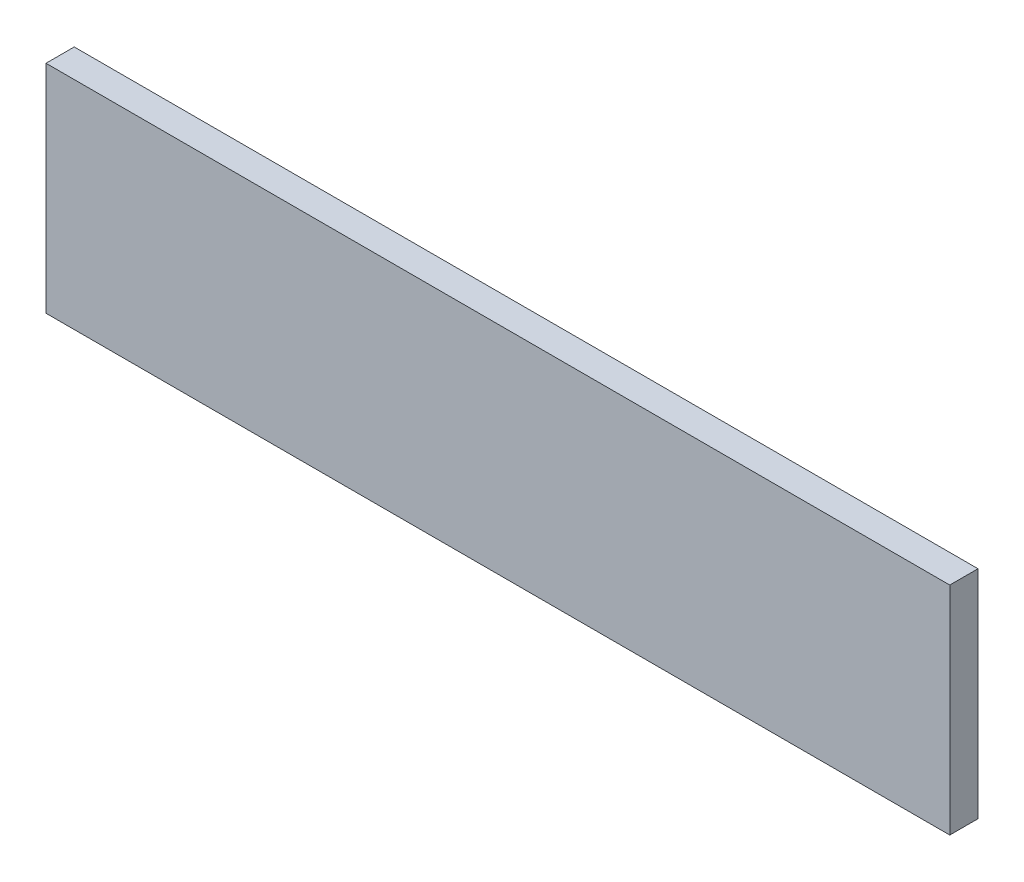
ISO-10303-21;
HEADER;
FILE_DESCRIPTION(('STEP AP214'),'2;1');
FILE_NAME('part.step','',(''),(''),'','','');
FILE_SCHEMA(('AUTOMOTIVE_DESIGN { 1 0 10303 214 1 1 1 1 }'));
ENDSEC;
DATA;
#1=APPLICATION_CONTEXT('core data for automotive mechanical design processes');
#2=APPLICATION_PROTOCOL_DEFINITION('international standard','automotive_design',2000,#1);
#3=PRODUCT_CONTEXT('',#1,'mechanical');
#4=PRODUCT('Part','Part','',(#3));
#5=PRODUCT_RELATED_PRODUCT_CATEGORY('part','',(#4));
#6=PRODUCT_DEFINITION_FORMATION('','',#4);
#7=PRODUCT_DEFINITION_CONTEXT('part definition',#1,'design');
#8=PRODUCT_DEFINITION('design','',#6,#7);
#9=PRODUCT_DEFINITION_SHAPE('','',#8);
#10=(LENGTH_UNIT() NAMED_UNIT(*) SI_UNIT(.MILLI.,.METRE.));
#11=(NAMED_UNIT(*) PLANE_ANGLE_UNIT() SI_UNIT($,.RADIAN.));
#12=(NAMED_UNIT(*) SI_UNIT($,.STERADIAN.) SOLID_ANGLE_UNIT());
#13=UNCERTAINTY_MEASURE_WITH_UNIT(LENGTH_MEASURE(1.E-05),#10,'distance_accuracy_value','');
#14=(GEOMETRIC_REPRESENTATION_CONTEXT(3) GLOBAL_UNCERTAINTY_ASSIGNED_CONTEXT((#13)) GLOBAL_UNIT_ASSIGNED_CONTEXT((#10,
#11,#12)) REPRESENTATION_CONTEXT('',''));
#15=CARTESIAN_POINT('',(0.,0.,0.));
#16=DIRECTION('',(0.,0.,1.));
#17=DIRECTION('',(1.,0.,0.));
#18=AXIS2_PLACEMENT_3D('',#15,#16,#17);
#19=CARTESIAN_POINT('',(304.8,73.025,19.05));
#20=DIRECTION('',(-1.,0.,0.));
#21=DIRECTION('',(0.,-1.,0.));
#22=AXIS2_PLACEMENT_3D('',#19,#20,#21);
#23=PLANE('',#22);
#24=DIRECTION('',(0.,1.,0.));
#25=VECTOR('',#24,1.);
#26=CARTESIAN_POINT('',(304.8,73.025,0.));
#27=LINE('',#26,#25);
#28=CARTESIAN_POINT('',(304.8,-73.025,0.));
#29=VERTEX_POINT('',#28);
#30=CARTESIAN_POINT('',(304.8,73.025,0.));
#31=VERTEX_POINT('',#30);
#32=EDGE_CURVE('E100',#29,#31,#27,.T.);
#33=ORIENTED_EDGE('',*,*,#32,.T.);
#34=DIRECTION('',(0.,0.,-1.));
#35=VECTOR('',#34,1.);
#36=CARTESIAN_POINT('',(304.8,73.025,19.05));
#37=LINE('',#36,#35);
#38=CARTESIAN_POINT('',(304.8,73.025,19.05));
#39=VERTEX_POINT('',#38);
#40=EDGE_CURVE('E11',#39,#31,#37,.T.);
#41=ORIENTED_EDGE('',*,*,#40,.F.);
#42=DIRECTION('',(0.,1.,0.));
#43=VECTOR('',#42,1.);
#44=CARTESIAN_POINT('',(304.8,73.025,19.05));
#45=LINE('',#44,#43);
#46=CARTESIAN_POINT('',(304.8,-73.025,19.05));
#47=VERTEX_POINT('',#46);
#48=EDGE_CURVE('E88',#47,#39,#45,.T.);
#49=ORIENTED_EDGE('',*,*,#48,.F.);
#50=DIRECTION('',(0.,0.,-1.));
#51=VECTOR('',#50,1.);
#52=CARTESIAN_POINT('',(304.8,-73.025,19.05));
#53=LINE('',#52,#51);
#54=EDGE_CURVE('E96',#47,#29,#53,.T.);
#55=ORIENTED_EDGE('',*,*,#54,.T.);
#56=EDGE_LOOP('',(#33,#41,#49,#55));
#57=FACE_BOUND('',#56,.T.);
#58=ADVANCED_FACE('F37',(#57),#23,.F.);
#59=CARTESIAN_POINT('',(-304.8,73.025,19.05));
#60=DIRECTION('',(0.,-1.,0.));
#61=DIRECTION('',(0.,0.,-1.));
#62=AXIS2_PLACEMENT_3D('',#59,#60,#61);
#63=PLANE('',#62);
#64=DIRECTION('',(-1.,0.,0.));
#65=VECTOR('',#64,1.);
#66=CARTESIAN_POINT('',(-304.8,73.025,0.));
#67=LINE('',#66,#65);
#68=CARTESIAN_POINT('',(-304.8,73.025,0.));
#69=VERTEX_POINT('',#68);
#70=EDGE_CURVE('E92',#31,#69,#67,.T.);
#71=ORIENTED_EDGE('',*,*,#70,.T.);
#72=DIRECTION('',(0.,0.,-1.));
#73=VECTOR('',#72,1.);
#74=CARTESIAN_POINT('',(-304.8,73.025,19.05));
#75=LINE('',#74,#73);
#76=CARTESIAN_POINT('',(-304.8,73.025,19.05));
#77=VERTEX_POINT('',#76);
#78=EDGE_CURVE('E45',#77,#69,#75,.T.);
#79=ORIENTED_EDGE('',*,*,#78,.F.);
#80=DIRECTION('',(-1.,0.,0.));
#81=VECTOR('',#80,1.);
#82=CARTESIAN_POINT('',(-304.8,73.025,19.05));
#83=LINE('',#82,#81);
#84=EDGE_CURVE('E83',#39,#77,#83,.T.);
#85=ORIENTED_EDGE('',*,*,#84,.F.);
#86=ORIENTED_EDGE('',*,*,#40,.T.);
#87=EDGE_LOOP('',(#71,#79,#85,#86));
#88=FACE_BOUND('',#87,.T.);
#89=ADVANCED_FACE('F91',(#88),#63,.F.);
#90=CARTESIAN_POINT('',(-304.8,73.025,19.05));
#91=DIRECTION('',(1.,0.,0.));
#92=DIRECTION('',(0.,1.,0.));
#93=AXIS2_PLACEMENT_3D('',#90,#91,#92);
#94=PLANE('',#93);
#95=DIRECTION('',(0.,-1.,0.));
#96=VECTOR('',#95,1.);
#97=CARTESIAN_POINT('',(-304.8,73.025,0.));
#98=LINE('',#97,#96);
#99=CARTESIAN_POINT('',(-304.8,-73.025,0.));
#100=VERTEX_POINT('',#99);
#101=EDGE_CURVE('E70',#69,#100,#98,.T.);
#102=ORIENTED_EDGE('',*,*,#101,.T.);
#103=DIRECTION('',(0.,0.,-1.));
#104=VECTOR('',#103,1.);
#105=CARTESIAN_POINT('',(-304.8,-73.025,19.05));
#106=LINE('',#105,#104);
#107=CARTESIAN_POINT('',(-304.8,-73.025,19.05));
#108=VERTEX_POINT('',#107);
#109=EDGE_CURVE('E93',#108,#100,#106,.T.);
#110=ORIENTED_EDGE('',*,*,#109,.F.);
#111=DIRECTION('',(0.,-1.,0.));
#112=VECTOR('',#111,1.);
#113=CARTESIAN_POINT('',(-304.8,73.025,19.05));
#114=LINE('',#113,#112);
#115=EDGE_CURVE('E86',#77,#108,#114,.T.);
#116=ORIENTED_EDGE('',*,*,#115,.F.);
#117=ORIENTED_EDGE('',*,*,#78,.T.);
#118=EDGE_LOOP('',(#102,#110,#116,#117));
#119=FACE_BOUND('',#118,.T.);
#120=ADVANCED_FACE('F94',(#119),#94,.F.);
#121=CARTESIAN_POINT('',(-304.8,-73.025,19.05));
#122=DIRECTION('',(0.,1.,0.));
#123=DIRECTION('',(0.,0.,1.));
#124=AXIS2_PLACEMENT_3D('',#121,#122,#123);
#125=PLANE('',#124);
#126=DIRECTION('',(1.,0.,0.));
#127=VECTOR('',#126,1.);
#128=CARTESIAN_POINT('',(-304.8,-73.025,0.));
#129=LINE('',#128,#127);
#130=EDGE_CURVE('E76',#100,#29,#129,.T.);
#131=ORIENTED_EDGE('',*,*,#130,.T.);
#132=ORIENTED_EDGE('',*,*,#54,.F.);
#133=DIRECTION('',(1.,0.,0.));
#134=VECTOR('',#133,1.);
#135=CARTESIAN_POINT('',(-304.8,-73.025,19.05));
#136=LINE('',#135,#134);
#137=EDGE_CURVE('E53',#108,#47,#136,.T.);
#138=ORIENTED_EDGE('',*,*,#137,.F.);
#139=ORIENTED_EDGE('',*,*,#109,.T.);
#140=EDGE_LOOP('',(#131,#132,#138,#139));
#141=FACE_BOUND('',#140,.T.);
#142=ADVANCED_FACE('F107',(#141),#125,.F.);
#143=CARTESIAN_POINT('',(0.,0.,19.05));
#144=DIRECTION('',(0.,0.,1.));
#145=DIRECTION('',(1.,0.,0.));
#146=AXIS2_PLACEMENT_3D('',#143,#144,#145);
#147=PLANE('',#146);
#148=ORIENTED_EDGE('',*,*,#48,.T.);
#149=ORIENTED_EDGE('',*,*,#84,.T.);
#150=ORIENTED_EDGE('',*,*,#115,.T.);
#151=ORIENTED_EDGE('',*,*,#137,.T.);
#152=EDGE_LOOP('',(#148,#149,#150,#151));
#153=FACE_BOUND('',#152,.T.);
#154=ADVANCED_FACE('F84',(#153),#147,.T.);
#155=CARTESIAN_POINT('',(0.,0.,0.));
#156=DIRECTION('',(0.,0.,1.));
#157=DIRECTION('',(1.,0.,0.));
#158=AXIS2_PLACEMENT_3D('',#155,#156,#157);
#159=PLANE('',#158);
#160=ORIENTED_EDGE('',*,*,#32,.F.);
#161=ORIENTED_EDGE('',*,*,#130,.F.);
#162=ORIENTED_EDGE('',*,*,#101,.F.);
#163=ORIENTED_EDGE('',*,*,#70,.F.);
#164=EDGE_LOOP('',(#160,#161,#162,#163));
#165=FACE_BOUND('',#164,.T.);
#166=ADVANCED_FACE('F110',(#165),#159,.F.);
#167=CLOSED_SHELL('',(#58,#89,#120,#142,#154,#166));
#168=MANIFOLD_SOLID_BREP('B2',#167);
#169=ADVANCED_BREP_SHAPE_REPRESENTATION('',(#18,#168),#14);
#170=SHAPE_DEFINITION_REPRESENTATION(#9,#169);
ENDSEC;
END-ISO-10303-21;
